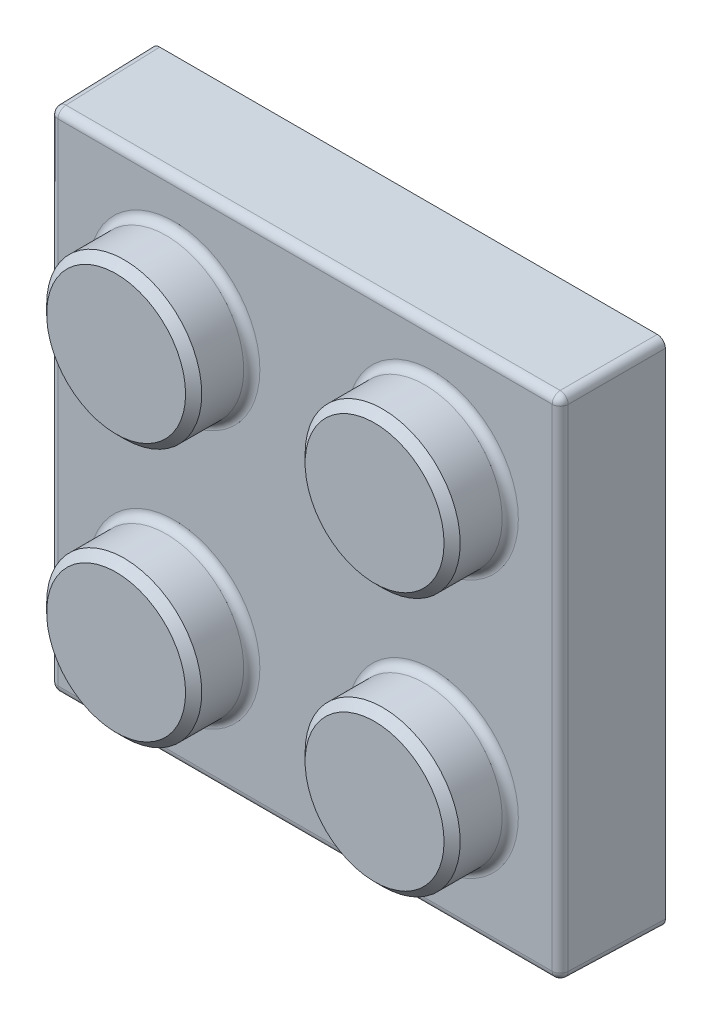
ISO-10303-21;
HEADER;
FILE_DESCRIPTION(('STEP AP214'),'2;1');
FILE_NAME('part.step','',(''),(''),'','','');
FILE_SCHEMA(('AUTOMOTIVE_DESIGN { 1 0 10303 214 1 1 1 1 }'));
ENDSEC;
DATA;
#1=APPLICATION_CONTEXT('core data for automotive mechanical design processes');
#2=APPLICATION_PROTOCOL_DEFINITION('international standard','automotive_design',2000,#1);
#3=PRODUCT_CONTEXT('',#1,'mechanical');
#4=PRODUCT('Part','Part','',(#3));
#5=PRODUCT_RELATED_PRODUCT_CATEGORY('part','',(#4));
#6=PRODUCT_DEFINITION_FORMATION('','',#4);
#7=PRODUCT_DEFINITION_CONTEXT('part definition',#1,'design');
#8=PRODUCT_DEFINITION('design','',#6,#7);
#9=PRODUCT_DEFINITION_SHAPE('','',#8);
#10=(LENGTH_UNIT() NAMED_UNIT(*) SI_UNIT(.MILLI.,.METRE.));
#11=(NAMED_UNIT(*) PLANE_ANGLE_UNIT() SI_UNIT($,.RADIAN.));
#12=(NAMED_UNIT(*) SI_UNIT($,.STERADIAN.) SOLID_ANGLE_UNIT());
#13=UNCERTAINTY_MEASURE_WITH_UNIT(LENGTH_MEASURE(1.E-05),#10,'distance_accuracy_value','');
#14=(GEOMETRIC_REPRESENTATION_CONTEXT(3) GLOBAL_UNCERTAINTY_ASSIGNED_CONTEXT((#13)) GLOBAL_UNIT_ASSIGNED_CONTEXT((#10,
#11,#12)) REPRESENTATION_CONTEXT('',''));
#15=CARTESIAN_POINT('',(0.,0.,0.));
#16=DIRECTION('',(0.,0.,1.));
#17=DIRECTION('',(1.,0.,0.));
#18=AXIS2_PLACEMENT_3D('',#15,#16,#17);
#19=CARTESIAN_POINT('',(0.,0.,0.));
#20=DIRECTION('',(0.,0.,-1.));
#21=DIRECTION('',(-1.,0.,0.));
#22=AXIS2_PLACEMENT_3D('',#19,#20,#21);
#23=PLANE('',#22);
#24=DIRECTION('',(0.,-1.,0.));
#25=VECTOR('',#24,1.);
#26=CARTESIAN_POINT('',(-7.95,7.89999999999999,0.));
#27=LINE('',#26,#25);
#28=CARTESIAN_POINT('',(-7.95,7.6500380762109,0.));
#29=VERTEX_POINT('',#28);
#30=CARTESIAN_POINT('',(-7.95,-7.65003807621091,0.));
#31=VERTEX_POINT('',#30);
#32=EDGE_CURVE('E232',#29,#31,#27,.T.);
#33=ORIENTED_EDGE('',*,*,#32,.F.);
#34=CARTESIAN_POINT('',(-7.69996191798902,7.64996191798902,0.));
#35=DIRECTION('',(0.,0.,-1.));
#36=DIRECTION('',(-0.707106781186548,0.707106781186547,0.));
#37=AXIS2_PLACEMENT_3D('',#34,#35,#36);
#38=ELLIPSE('',#37,0.250076158222762,0.25);
#39=CARTESIAN_POINT('',(-7.7000380762109,7.89999999999999,0.));
#40=VERTEX_POINT('',#39);
#41=EDGE_CURVE('E11',#29,#40,#38,.T.);
#42=ORIENTED_EDGE('',*,*,#41,.T.);
#43=DIRECTION('',(-1.,0.,0.));
#44=VECTOR('',#43,1.);
#45=CARTESIAN_POINT('',(7.95,7.9,0.));
#46=LINE('',#45,#44);
#47=CARTESIAN_POINT('',(7.7000380762109,7.9,0.));
#48=VERTEX_POINT('',#47);
#49=EDGE_CURVE('E243',#48,#40,#46,.T.);
#50=ORIENTED_EDGE('',*,*,#49,.F.);
#51=CARTESIAN_POINT('',(7.69996191798903,7.64996191798902,0.));
#52=DIRECTION('',(0.,0.,-1.));
#53=DIRECTION('',(0.707106781186547,0.707106781186548,0.));
#54=AXIS2_PLACEMENT_3D('',#51,#52,#53);
#55=ELLIPSE('',#54,0.250076158222762,0.25);
#56=CARTESIAN_POINT('',(7.95,7.6500380762109,0.));
#57=VERTEX_POINT('',#56);
#58=EDGE_CURVE('E54',#48,#57,#55,.T.);
#59=ORIENTED_EDGE('',*,*,#58,.T.);
#60=DIRECTION('',(0.,1.,0.));
#61=VECTOR('',#60,1.);
#62=CARTESIAN_POINT('',(7.95,7.9,0.));
#63=LINE('',#62,#61);
#64=CARTESIAN_POINT('',(7.95,-7.65003807621091,0.));
#65=VERTEX_POINT('',#64);
#66=EDGE_CURVE('E239',#65,#57,#63,.T.);
#67=ORIENTED_EDGE('',*,*,#66,.F.);
#68=CARTESIAN_POINT('',(7.69996191798903,-7.64996191798903,0.));
#69=DIRECTION('',(0.,0.,-1.));
#70=DIRECTION('',(0.707106781186548,-0.707106781186547,0.));
#71=AXIS2_PLACEMENT_3D('',#68,#69,#70);
#72=ELLIPSE('',#71,0.250076158222762,0.25);
#73=CARTESIAN_POINT('',(7.70003807621091,-7.90000000000001,0.));
#74=VERTEX_POINT('',#73);
#75=EDGE_CURVE('E354',#65,#74,#72,.T.);
#76=ORIENTED_EDGE('',*,*,#75,.T.);
#77=DIRECTION('',(1.,0.,0.));
#78=VECTOR('',#77,1.);
#79=CARTESIAN_POINT('',(7.95,-7.90000000000001,0.));
#80=LINE('',#79,#78);
#81=CARTESIAN_POINT('',(-7.7000380762109,-7.90000000000001,0.));
#82=VERTEX_POINT('',#81);
#83=EDGE_CURVE('E235',#82,#74,#80,.T.);
#84=ORIENTED_EDGE('',*,*,#83,.F.);
#85=CARTESIAN_POINT('',(-7.69996191798902,-7.64996191798903,0.));
#86=DIRECTION('',(0.,0.,-1.));
#87=DIRECTION('',(-0.707106781186547,-0.707106781186548,0.));
#88=AXIS2_PLACEMENT_3D('',#85,#86,#87);
#89=ELLIPSE('',#88,0.250076158222762,0.25);
#90=EDGE_CURVE('E351',#82,#31,#89,.T.);
#91=ORIENTED_EDGE('',*,*,#90,.T.);
#92=EDGE_LOOP('',(#33,#42,#50,#59,#67,#76,#84,#91));
#93=FACE_BOUND('',#92,.T.);
#94=DIRECTION('',(1.,0.,0.));
#95=VECTOR('',#94,1.);
#96=CARTESIAN_POINT('',(0.,6.6998172063473,0.));
#97=LINE('',#96,#95);
#98=CARTESIAN_POINT('',(6.74981720634731,6.69981720634731,0.));
#99=VERTEX_POINT('',#98);
#100=CARTESIAN_POINT('',(-6.74981720634731,6.6998172063473,0.));
#101=VERTEX_POINT('',#100);
#102=EDGE_CURVE('E200',#99,#101,#97,.F.);
#103=ORIENTED_EDGE('',*,*,#102,.T.);
#104=DIRECTION('',(0.,1.,0.));
#105=VECTOR('',#104,1.);
#106=CARTESIAN_POINT('',(-6.74981720634731,0.,0.));
#107=LINE('',#106,#105);
#108=CARTESIAN_POINT('',(-6.74981720634731,-6.69981720634732,0.));
#109=VERTEX_POINT('',#108);
#110=EDGE_CURVE('E195',#101,#109,#107,.F.);
#111=ORIENTED_EDGE('',*,*,#110,.T.);
#112=DIRECTION('',(-1.,0.,0.));
#113=VECTOR('',#112,1.);
#114=CARTESIAN_POINT('',(0.,-6.69981720634732,0.));
#115=LINE('',#114,#113);
#116=CARTESIAN_POINT('',(6.74981720634731,-6.69981720634732,0.));
#117=VERTEX_POINT('',#116);
#118=EDGE_CURVE('E199',#109,#117,#115,.F.);
#119=ORIENTED_EDGE('',*,*,#118,.T.);
#120=DIRECTION('',(0.,-1.,0.));
#121=VECTOR('',#120,1.);
#122=CARTESIAN_POINT('',(6.74981720634731,0.,0.));
#123=LINE('',#122,#121);
#124=EDGE_CURVE('E166',#117,#99,#123,.F.);
#125=ORIENTED_EDGE('',*,*,#124,.T.);
#126=EDGE_LOOP('',(#103,#111,#119,#125));
#127=FACE_BOUND('',#126,.T.);
#128=ADVANCED_FACE('F44',(#93,#127),#23,.T.);
#129=CARTESIAN_POINT('',(3.95,3.99999999999999,5.));
#130=DIRECTION('',(0.,0.,-1.));
#131=DIRECTION('',(-1.,0.,0.));
#132=AXIS2_PLACEMENT_3D('',#129,#130,#131);
#133=CONICAL_SURFACE('',#132,2.15,0.785398163397446);
#134=CARTESIAN_POINT('',(3.95,3.99999999999999,4.75));
#135=DIRECTION('',(0.,0.,1.));
#136=DIRECTION('',(1.,0.,0.));
#137=AXIS2_PLACEMENT_3D('',#134,#135,#136);
#138=CIRCLE('',#137,2.4);
#139=CARTESIAN_POINT('',(6.35,3.99999999999999,4.75));
#140=VERTEX_POINT('',#139);
#141=EDGE_CURVE('E263',#140,#140,#138,.F.);
#142=ORIENTED_EDGE('',*,*,#141,.F.);
#143=EDGE_LOOP('',(#142));
#144=FACE_BOUND('',#143,.T.);
#145=CARTESIAN_POINT('',(3.95,3.99999999999999,5.));
#146=DIRECTION('',(0.,0.,1.));
#147=DIRECTION('',(1.,0.,0.));
#148=AXIS2_PLACEMENT_3D('',#145,#146,#147);
#149=CIRCLE('',#148,2.15);
#150=CARTESIAN_POINT('',(6.1,3.99999999999999,5.));
#151=VERTEX_POINT('',#150);
#152=EDGE_CURVE('E267',#151,#151,#149,.T.);
#153=ORIENTED_EDGE('',*,*,#152,.F.);
#154=EDGE_LOOP('',(#153));
#155=FACE_BOUND('',#154,.T.);
#156=ADVANCED_FACE('F479',(#144,#155),#133,.T.);
#157=CARTESIAN_POINT('',(3.95,3.99999999999999,5.));
#158=DIRECTION('',(0.,0.,1.));
#159=DIRECTION('',(1.,0.,0.));
#160=AXIS2_PLACEMENT_3D('',#157,#158,#159);
#161=PLANE('',#160);
#162=ORIENTED_EDGE('',*,*,#152,.T.);
#163=EDGE_LOOP('',(#162));
#164=FACE_BOUND('',#163,.T.);
#165=ADVANCED_FACE('F484',(#164),#161,.T.);
#166=CARTESIAN_POINT('',(3.95,3.99999999999999,5.));
#167=DIRECTION('',(0.,0.,-1.));
#168=DIRECTION('',(-1.,0.,0.));
#169=AXIS2_PLACEMENT_3D('',#166,#167,#168);
#170=CYLINDRICAL_SURFACE('',#169,2.4);
#171=CARTESIAN_POINT('',(3.95,3.99999999999999,3.45));
#172=DIRECTION('',(0.,0.,-1.));
#173=DIRECTION('',(-1.,0.,0.));
#174=AXIS2_PLACEMENT_3D('',#171,#172,#173);
#175=CIRCLE('',#174,2.4);
#176=CARTESIAN_POINT('',(1.55,3.99999999999999,3.45));
#177=VERTEX_POINT('',#176);
#178=EDGE_CURVE('E271',#177,#177,#175,.F.);
#179=ORIENTED_EDGE('',*,*,#178,.T.);
#180=EDGE_LOOP('',(#179));
#181=FACE_BOUND('',#180,.T.);
#182=ORIENTED_EDGE('',*,*,#141,.T.);
#183=EDGE_LOOP('',(#182));
#184=FACE_BOUND('',#183,.T.);
#185=ADVANCED_FACE('F523',(#181,#184),#170,.T.);
#186=CARTESIAN_POINT('',(3.95,-4.00000000000001,5.));
#187=DIRECTION('',(0.,0.,-1.));
#188=DIRECTION('',(-1.,0.,0.));
#189=AXIS2_PLACEMENT_3D('',#186,#187,#188);
#190=CONICAL_SURFACE('',#189,2.15,0.785398163397446);
#191=CARTESIAN_POINT('',(3.95,-4.00000000000001,4.75));
#192=DIRECTION('',(0.,0.,1.));
#193=DIRECTION('',(1.,0.,0.));
#194=AXIS2_PLACEMENT_3D('',#191,#192,#193);
#195=CIRCLE('',#194,2.4);
#196=CARTESIAN_POINT('',(6.35,-4.00000000000001,4.75));
#197=VERTEX_POINT('',#196);
#198=EDGE_CURVE('E255',#197,#197,#195,.F.);
#199=ORIENTED_EDGE('',*,*,#198,.F.);
#200=EDGE_LOOP('',(#199));
#201=FACE_BOUND('',#200,.T.);
#202=CARTESIAN_POINT('',(3.95,-4.00000000000001,5.));
#203=DIRECTION('',(0.,0.,1.));
#204=DIRECTION('',(1.,0.,0.));
#205=AXIS2_PLACEMENT_3D('',#202,#203,#204);
#206=CIRCLE('',#205,2.15);
#207=CARTESIAN_POINT('',(6.1,-4.00000000000001,5.));
#208=VERTEX_POINT('',#207);
#209=EDGE_CURVE('E259',#208,#208,#206,.T.);
#210=ORIENTED_EDGE('',*,*,#209,.F.);
#211=EDGE_LOOP('',(#210));
#212=FACE_BOUND('',#211,.T.);
#213=ADVANCED_FACE('F515',(#201,#212),#190,.T.);
#214=CARTESIAN_POINT('',(3.95,-4.00000000000001,5.));
#215=DIRECTION('',(0.,0.,1.));
#216=DIRECTION('',(1.,0.,0.));
#217=AXIS2_PLACEMENT_3D('',#214,#215,#216);
#218=PLANE('',#217);
#219=ORIENTED_EDGE('',*,*,#209,.T.);
#220=EDGE_LOOP('',(#219));
#221=FACE_BOUND('',#220,.T.);
#222=ADVANCED_FACE('F511',(#221),#218,.T.);
#223=CARTESIAN_POINT('',(3.95,-4.00000000000001,5.));
#224=DIRECTION('',(0.,0.,-1.));
#225=DIRECTION('',(-1.,0.,0.));
#226=AXIS2_PLACEMENT_3D('',#223,#224,#225);
#227=CYLINDRICAL_SURFACE('',#226,2.4);
#228=CARTESIAN_POINT('',(3.95,-4.00000000000001,3.45));
#229=DIRECTION('',(0.,0.,-1.));
#230=DIRECTION('',(-1.,0.,0.));
#231=AXIS2_PLACEMENT_3D('',#228,#229,#230);
#232=CIRCLE('',#231,2.4);
#233=CARTESIAN_POINT('',(1.55,-4.00000000000001,3.45));
#234=VERTEX_POINT('',#233);
#235=EDGE_CURVE('E304',#234,#234,#232,.F.);
#236=ORIENTED_EDGE('',*,*,#235,.T.);
#237=EDGE_LOOP('',(#236));
#238=FACE_BOUND('',#237,.T.);
#239=ORIENTED_EDGE('',*,*,#198,.T.);
#240=EDGE_LOOP('',(#239));
#241=FACE_BOUND('',#240,.T.);
#242=ADVANCED_FACE('F492',(#238,#241),#227,.T.);
#243=CARTESIAN_POINT('',(-7.95,7.89999999999999,0.));
#244=DIRECTION('',(-0.999847695156391,0.,0.0174524064372835));
#245=DIRECTION('',(0.0174524064372835,0.,0.999847695156391));
#246=AXIS2_PLACEMENT_3D('',#243,#244,#245);
#247=PLANE('',#246);
#248=DIRECTION('',(0.,-1.,0.));
#249=VECTOR('',#248,1.);
#250=CARTESIAN_POINT('',(-7.89843140023988,7.89999999999999,2.95436310160932));
#251=LINE('',#250,#249);
#252=CARTESIAN_POINT('',(-7.89843140023988,-7.59846947645079,2.95436310160932));
#253=VERTEX_POINT('',#252);
#254=CARTESIAN_POINT('',(-7.89843140023988,7.59846947645077,2.95436310160932));
#255=VERTEX_POINT('',#254);
#256=EDGE_CURVE('E62',#253,#255,#251,.F.);
#257=ORIENTED_EDGE('',*,*,#256,.T.);
#258=DIRECTION('',(0.0174497491606827,-0.0174497491606827,0.999695459881888));
#259=VECTOR('',#258,1.);
#260=CARTESIAN_POINT('',(-7.95007611184247,7.65011418805337,-0.00436044453501649));
#261=LINE('',#260,#259);
#262=EDGE_CURVE('E340',#255,#29,#261,.F.);
#263=ORIENTED_EDGE('',*,*,#262,.T.);
#264=ORIENTED_EDGE('',*,*,#32,.T.);
#265=DIRECTION('',(0.0174497491606827,0.0174497491606827,0.999695459881888));
#266=VECTOR('',#265,1.);
#267=CARTESIAN_POINT('',(-7.9452651106593,-7.64530318687021,0.271261628654778));
#268=LINE('',#267,#266);
#269=EDGE_CURVE('E67',#31,#253,#268,.T.);
#270=ORIENTED_EDGE('',*,*,#269,.T.);
#271=EDGE_LOOP('',(#257,#263,#264,#270));
#272=FACE_BOUND('',#271,.T.);
#273=ADVANCED_FACE('F440',(#272),#247,.T.);
#274=CARTESIAN_POINT('',(7.95,-7.90000000000001,0.));
#275=DIRECTION('',(0.,-0.999847695156391,0.0174524064372835));
#276=DIRECTION('',(0.,-0.0174524064372835,-0.999847695156391));
#277=AXIS2_PLACEMENT_3D('',#274,#275,#276);
#278=PLANE('',#277);
#279=ORIENTED_EDGE('',*,*,#83,.T.);
#280=DIRECTION('',(-0.0174497491606827,0.0174497491606827,0.999695459881888));
#281=VECTOR('',#280,1.);
#282=CARTESIAN_POINT('',(7.70011418805338,-7.90007611184248,-0.00436044453501648));
#283=LINE('',#282,#281);
#284=CARTESIAN_POINT('',(7.64846947645078,-7.84843140023988,2.95436310160932));
#285=VERTEX_POINT('',#284);
#286=EDGE_CURVE('E333',#74,#285,#283,.T.);
#287=ORIENTED_EDGE('',*,*,#286,.T.);
#288=DIRECTION('',(1.,0.,0.));
#289=VECTOR('',#288,1.);
#290=CARTESIAN_POINT('',(7.95,-7.84843140023988,2.95436310160932));
#291=LINE('',#290,#289);
#292=CARTESIAN_POINT('',(-7.64846947645078,-7.84843140023989,2.95436310160932));
#293=VERTEX_POINT('',#292);
#294=EDGE_CURVE('E330',#285,#293,#291,.F.);
#295=ORIENTED_EDGE('',*,*,#294,.T.);
#296=DIRECTION('',(0.0174497491606827,0.0174497491606827,0.999695459881888));
#297=VECTOR('',#296,1.);
#298=CARTESIAN_POINT('',(-7.69527273749562,-7.89523466128473,0.273006072155979));
#299=LINE('',#298,#297);
#300=EDGE_CURVE('E327',#293,#82,#299,.F.);
#301=ORIENTED_EDGE('',*,*,#300,.T.);
#302=EDGE_LOOP('',(#279,#287,#295,#301));
#303=FACE_BOUND('',#302,.T.);
#304=ADVANCED_FACE('F430',(#303),#278,.T.);
#305=CARTESIAN_POINT('',(7.95,7.9,0.));
#306=DIRECTION('',(0.999847695156391,0.,0.0174524064372835));
#307=DIRECTION('',(0.0174524064372835,0.,-0.999847695156391));
#308=AXIS2_PLACEMENT_3D('',#305,#306,#307);
#309=PLANE('',#308);
#310=ORIENTED_EDGE('',*,*,#66,.T.);
#311=DIRECTION('',(-0.0174497491606827,-0.0174497491606827,0.999695459881888));
#312=VECTOR('',#311,1.);
#313=CARTESIAN_POINT('',(7.95007611184248,7.65011418805337,-0.0043604445350165));
#314=LINE('',#313,#312);
#315=CARTESIAN_POINT('',(7.89843140023988,7.59846947645078,2.95436310160932));
#316=VERTEX_POINT('',#315);
#317=EDGE_CURVE('E324',#57,#316,#314,.T.);
#318=ORIENTED_EDGE('',*,*,#317,.T.);
#319=DIRECTION('',(0.,1.,0.));
#320=VECTOR('',#319,1.);
#321=CARTESIAN_POINT('',(7.89843140023988,7.9,2.95436310160932));
#322=LINE('',#321,#320);
#323=CARTESIAN_POINT('',(7.89843140023988,-7.59846947645079,2.95436310160932));
#324=VERTEX_POINT('',#323);
#325=EDGE_CURVE('E321',#316,#324,#322,.F.);
#326=ORIENTED_EDGE('',*,*,#325,.T.);
#327=DIRECTION('',(-0.0174497491606827,0.0174497491606827,0.999695459881888));
#328=VECTOR('',#327,1.);
#329=CARTESIAN_POINT('',(7.9452651106593,-7.6453031868702,0.271261628654778));
#330=LINE('',#329,#328);
#331=EDGE_CURVE('E318',#324,#65,#330,.F.);
#332=ORIENTED_EDGE('',*,*,#331,.T.);
#333=EDGE_LOOP('',(#310,#318,#326,#332));
#334=FACE_BOUND('',#333,.T.);
#335=ADVANCED_FACE('F464',(#334),#309,.T.);
#336=CARTESIAN_POINT('',(7.95,7.9,0.));
#337=DIRECTION('',(0.,0.999847695156391,0.0174524064372835));
#338=DIRECTION('',(0.,-0.0174524064372835,0.999847695156391));
#339=AXIS2_PLACEMENT_3D('',#336,#337,#338);
#340=PLANE('',#339);
#341=ORIENTED_EDGE('',*,*,#49,.T.);
#342=DIRECTION('',(0.0174497491606827,-0.0174497491606827,0.999695459881888));
#343=VECTOR('',#342,1.);
#344=CARTESIAN_POINT('',(-7.69527273749562,7.89523466128471,0.273006072155979));
#345=LINE('',#344,#343);
#346=CARTESIAN_POINT('',(-7.64846947645078,7.84843140023987,2.95436310160932));
#347=VERTEX_POINT('',#346);
#348=EDGE_CURVE('E315',#40,#347,#345,.T.);
#349=ORIENTED_EDGE('',*,*,#348,.T.);
#350=DIRECTION('',(-1.,0.,0.));
#351=VECTOR('',#350,1.);
#352=CARTESIAN_POINT('',(7.95,7.84843140023987,2.95436310160932));
#353=LINE('',#352,#351);
#354=CARTESIAN_POINT('',(7.64846947645078,7.84843140023987,2.95436310160932));
#355=VERTEX_POINT('',#354);
#356=EDGE_CURVE('E311',#347,#355,#353,.F.);
#357=ORIENTED_EDGE('',*,*,#356,.T.);
#358=DIRECTION('',(-0.0174497491606827,-0.0174497491606827,0.999695459881888));
#359=VECTOR('',#358,1.);
#360=CARTESIAN_POINT('',(7.70011418805338,7.90007611184247,-0.0043604445350165));
#361=LINE('',#360,#359);
#362=EDGE_CURVE('E308',#355,#48,#361,.F.);
#363=ORIENTED_EDGE('',*,*,#362,.T.);
#364=EDGE_LOOP('',(#341,#349,#357,#363));
#365=FACE_BOUND('',#364,.T.);
#366=ADVANCED_FACE('F455',(#365),#340,.T.);
#367=CARTESIAN_POINT('',(0.,0.,3.2));
#368=DIRECTION('',(0.,0.,-1.));
#369=DIRECTION('',(-1.,0.,0.));
#370=AXIS2_PLACEMENT_3D('',#367,#368,#369);
#371=PLANE('',#370);
#372=CARTESIAN_POINT('',(3.95,3.99999999999999,3.2));
#373=DIRECTION('',(0.,0.,-1.));
#374=DIRECTION('',(-1.,0.,0.));
#375=AXIS2_PLACEMENT_3D('',#372,#373,#374);
#376=CIRCLE('',#375,2.65);
#377=CARTESIAN_POINT('',(1.3,3.99999999999999,3.2));
#378=VERTEX_POINT('',#377);
#379=EDGE_CURVE('E300',#378,#378,#376,.T.);
#380=ORIENTED_EDGE('',*,*,#379,.T.);
#381=EDGE_LOOP('',(#380));
#382=FACE_BOUND('',#381,.T.);
#383=CARTESIAN_POINT('',(3.95,-4.00000000000001,3.2));
#384=DIRECTION('',(0.,0.,-1.));
#385=DIRECTION('',(-1.,0.,0.));
#386=AXIS2_PLACEMENT_3D('',#383,#384,#385);
#387=CIRCLE('',#386,2.65);
#388=CARTESIAN_POINT('',(1.3,-4.00000000000001,3.2));
#389=VERTEX_POINT('',#388);
#390=EDGE_CURVE('E296',#389,#389,#387,.T.);
#391=ORIENTED_EDGE('',*,*,#390,.T.);
#392=EDGE_LOOP('',(#391));
#393=FACE_BOUND('',#392,.T.);
#394=DIRECTION('',(0.,-1.,0.));
#395=VECTOR('',#394,1.);
#396=CARTESIAN_POINT('',(7.64846947645078,0.,3.2));
#397=LINE('',#396,#395);
#398=CARTESIAN_POINT('',(7.64846947645078,-7.59846947645079,3.2));
#399=VERTEX_POINT('',#398);
#400=CARTESIAN_POINT('',(7.64846947645078,7.59846947645078,3.2));
#401=VERTEX_POINT('',#400);
#402=EDGE_CURVE('E289',#399,#401,#397,.F.);
#403=ORIENTED_EDGE('',*,*,#402,.T.);
#404=DIRECTION('',(1.,0.,0.));
#405=VECTOR('',#404,1.);
#406=CARTESIAN_POINT('',(0.,7.59846947645078,3.2));
#407=LINE('',#406,#405);
#408=CARTESIAN_POINT('',(-7.64846947645078,7.59846947645077,3.2));
#409=VERTEX_POINT('',#408);
#410=EDGE_CURVE('E292',#401,#409,#407,.F.);
#411=ORIENTED_EDGE('',*,*,#410,.T.);
#412=DIRECTION('',(0.,1.,0.));
#413=VECTOR('',#412,1.);
#414=CARTESIAN_POINT('',(-7.64846947645078,0.,3.2));
#415=LINE('',#414,#413);
#416=CARTESIAN_POINT('',(-7.64846947645078,-7.59846947645079,3.2));
#417=VERTEX_POINT('',#416);
#418=EDGE_CURVE('E283',#409,#417,#415,.F.);
#419=ORIENTED_EDGE('',*,*,#418,.T.);
#420=DIRECTION('',(-1.,0.,0.));
#421=VECTOR('',#420,1.);
#422=CARTESIAN_POINT('',(0.,-7.59846947645079,3.2));
#423=LINE('',#422,#421);
#424=EDGE_CURVE('E286',#417,#399,#423,.F.);
#425=ORIENTED_EDGE('',*,*,#424,.T.);
#426=EDGE_LOOP('',(#403,#411,#419,#425));
#427=FACE_BOUND('',#426,.T.);
#428=CARTESIAN_POINT('',(-4.05,-4.00000000000001,3.2));
#429=DIRECTION('',(0.,0.,-1.));
#430=DIRECTION('',(-1.,0.,0.));
#431=AXIS2_PLACEMENT_3D('',#428,#429,#430);
#432=CIRCLE('',#431,2.65);
#433=CARTESIAN_POINT('',(-6.7,-4.00000000000001,3.2));
#434=VERTEX_POINT('',#433);
#435=EDGE_CURVE('E279',#434,#434,#432,.T.);
#436=ORIENTED_EDGE('',*,*,#435,.T.);
#437=EDGE_LOOP('',(#436));
#438=FACE_BOUND('',#437,.T.);
#439=CARTESIAN_POINT('',(-4.05,3.99999999999999,3.2));
#440=DIRECTION('',(0.,0.,-1.));
#441=DIRECTION('',(-1.,0.,0.));
#442=AXIS2_PLACEMENT_3D('',#439,#440,#441);
#443=CIRCLE('',#442,2.65);
#444=CARTESIAN_POINT('',(-6.7,3.99999999999999,3.2));
#445=VERTEX_POINT('',#444);
#446=EDGE_CURVE('E275',#445,#445,#443,.T.);
#447=ORIENTED_EDGE('',*,*,#446,.T.);
#448=EDGE_LOOP('',(#447));
#449=FACE_BOUND('',#448,.T.);
#450=ADVANCED_FACE('F419',(#382,#393,#427,#438,#449),#371,.F.);
#451=CARTESIAN_POINT('',(-4.05,-4.00000000000001,5.));
#452=DIRECTION('',(0.,0.,-1.));
#453=DIRECTION('',(-1.,0.,0.));
#454=AXIS2_PLACEMENT_3D('',#451,#452,#453);
#455=CYLINDRICAL_SURFACE('',#454,2.4);
#456=CARTESIAN_POINT('',(-4.05,-4.00000000000001,3.45));
#457=DIRECTION('',(0.,0.,-1.));
#458=DIRECTION('',(-1.,0.,0.));
#459=AXIS2_PLACEMENT_3D('',#456,#457,#458);
#460=CIRCLE('',#459,2.4);
#461=CARTESIAN_POINT('',(-6.45,-4.00000000000001,3.45));
#462=VERTEX_POINT('',#461);
#463=EDGE_CURVE('E343',#462,#462,#460,.F.);
#464=ORIENTED_EDGE('',*,*,#463,.T.);
#465=EDGE_LOOP('',(#464));
#466=FACE_BOUND('',#465,.T.);
#467=CARTESIAN_POINT('',(-4.05,-4.00000000000001,4.75));
#468=DIRECTION('',(0.,0.,1.));
#469=DIRECTION('',(1.,0.,0.));
#470=AXIS2_PLACEMENT_3D('',#467,#468,#469);
#471=CIRCLE('',#470,2.4);
#472=CARTESIAN_POINT('',(-1.65,-4.00000000000001,4.75));
#473=VERTEX_POINT('',#472);
#474=EDGE_CURVE('E251',#473,#473,#471,.F.);
#475=ORIENTED_EDGE('',*,*,#474,.T.);
#476=EDGE_LOOP('',(#475));
#477=FACE_BOUND('',#476,.T.);
#478=ADVANCED_FACE('F921',(#466,#477),#455,.T.);
#479=CARTESIAN_POINT('',(-4.05,-4.00000000000001,5.));
#480=DIRECTION('',(0.,0.,1.));
#481=DIRECTION('',(1.,0.,0.));
#482=AXIS2_PLACEMENT_3D('',#479,#480,#481);
#483=PLANE('',#482);
#484=CARTESIAN_POINT('',(-4.05,-4.00000000000001,5.));
#485=DIRECTION('',(0.,0.,1.));
#486=DIRECTION('',(1.,0.,0.));
#487=AXIS2_PLACEMENT_3D('',#484,#485,#486);
#488=CIRCLE('',#487,2.15);
#489=CARTESIAN_POINT('',(-1.9,-4.00000000000001,5.));
#490=VERTEX_POINT('',#489);
#491=EDGE_CURVE('E247',#490,#490,#488,.T.);
#492=ORIENTED_EDGE('',*,*,#491,.T.);
#493=EDGE_LOOP('',(#492));
#494=FACE_BOUND('',#493,.T.);
#495=ADVANCED_FACE('F507',(#494),#483,.T.);
#496=CARTESIAN_POINT('',(-4.05,-4.00000000000001,5.));
#497=DIRECTION('',(0.,0.,-1.));
#498=DIRECTION('',(-1.,0.,0.));
#499=AXIS2_PLACEMENT_3D('',#496,#497,#498);
#500=CONICAL_SURFACE('',#499,2.15,0.785398163397446);
#501=ORIENTED_EDGE('',*,*,#474,.F.);
#502=EDGE_LOOP('',(#501));
#503=FACE_BOUND('',#502,.T.);
#504=ORIENTED_EDGE('',*,*,#491,.F.);
#505=EDGE_LOOP('',(#504));
#506=FACE_BOUND('',#505,.T.);
#507=ADVANCED_FACE('F500',(#503,#506),#500,.T.);
#508=CARTESIAN_POINT('',(-4.05,3.99999999999999,5.));
#509=DIRECTION('',(0.,0.,-1.));
#510=DIRECTION('',(-1.,0.,0.));
#511=AXIS2_PLACEMENT_3D('',#508,#509,#510);
#512=CYLINDRICAL_SURFACE('',#511,2.4);
#513=CARTESIAN_POINT('',(-4.05,3.99999999999999,3.45));
#514=DIRECTION('',(0.,0.,-1.));
#515=DIRECTION('',(-1.,0.,0.));
#516=AXIS2_PLACEMENT_3D('',#513,#514,#515);
#517=CIRCLE('',#516,2.4);
#518=CARTESIAN_POINT('',(-6.45,3.99999999999999,3.45));
#519=VERTEX_POINT('',#518);
#520=EDGE_CURVE('E347',#519,#519,#517,.F.);
#521=ORIENTED_EDGE('',*,*,#520,.T.);
#522=EDGE_LOOP('',(#521));
#523=FACE_BOUND('',#522,.T.);
#524=CARTESIAN_POINT('',(-4.05,3.99999999999999,4.75));
#525=DIRECTION('',(0.,0.,1.));
#526=DIRECTION('',(1.,0.,0.));
#527=AXIS2_PLACEMENT_3D('',#524,#525,#526);
#528=CIRCLE('',#527,2.4);
#529=CARTESIAN_POINT('',(-1.65,3.99999999999999,4.75));
#530=VERTEX_POINT('',#529);
#531=EDGE_CURVE('E224',#530,#530,#528,.F.);
#532=ORIENTED_EDGE('',*,*,#531,.T.);
#533=EDGE_LOOP('',(#532));
#534=FACE_BOUND('',#533,.T.);
#535=ADVANCED_FACE('F506',(#523,#534),#512,.T.);
#536=CARTESIAN_POINT('',(-4.05,3.99999999999999,5.));
#537=DIRECTION('',(0.,0.,1.));
#538=DIRECTION('',(1.,0.,0.));
#539=AXIS2_PLACEMENT_3D('',#536,#537,#538);
#540=PLANE('',#539);
#541=CARTESIAN_POINT('',(-4.05,3.99999999999999,5.));
#542=DIRECTION('',(0.,0.,1.));
#543=DIRECTION('',(1.,0.,0.));
#544=AXIS2_PLACEMENT_3D('',#541,#542,#543);
#545=CIRCLE('',#544,2.15);
#546=CARTESIAN_POINT('',(-1.9,3.99999999999999,5.));
#547=VERTEX_POINT('',#546);
#548=EDGE_CURVE('E228',#547,#547,#545,.T.);
#549=ORIENTED_EDGE('',*,*,#548,.T.);
#550=EDGE_LOOP('',(#549));
#551=FACE_BOUND('',#550,.T.);
#552=ADVANCED_FACE('F841',(#551),#540,.T.);
#553=CARTESIAN_POINT('',(-4.05,3.99999999999999,5.));
#554=DIRECTION('',(0.,0.,-1.));
#555=DIRECTION('',(-1.,0.,0.));
#556=AXIS2_PLACEMENT_3D('',#553,#554,#555);
#557=CONICAL_SURFACE('',#556,2.15,0.785398163397446);
#558=ORIENTED_EDGE('',*,*,#531,.F.);
#559=EDGE_LOOP('',(#558));
#560=FACE_BOUND('',#559,.T.);
#561=ORIENTED_EDGE('',*,*,#548,.F.);
#562=EDGE_LOOP('',(#561));
#563=FACE_BOUND('',#562,.T.);
#564=ADVANCED_FACE('F700',(#560,#563),#557,.T.);
#565=CARTESIAN_POINT('',(-4.05,3.99999999999999,3.8));
#566=DIRECTION('',(0.,0.,1.));
#567=DIRECTION('',(1.,0.,0.));
#568=AXIS2_PLACEMENT_3D('',#565,#566,#567);
#569=PLANE('',#568);
#570=CARTESIAN_POINT('',(-4.05,3.99999999999999,3.8));
#571=DIRECTION('',(0.,0.,1.));
#572=DIRECTION('',(1.,0.,0.));
#573=AXIS2_PLACEMENT_3D('',#570,#571,#572);
#574=CIRCLE('',#573,1.2);
#575=CARTESIAN_POINT('',(-2.85,3.99999999999999,3.8));
#576=VERTEX_POINT('',#575);
#577=EDGE_CURVE('E220',#576,#576,#574,.T.);
#578=ORIENTED_EDGE('',*,*,#577,.F.);
#579=EDGE_LOOP('',(#578));
#580=FACE_BOUND('',#579,.T.);
#581=ADVANCED_FACE('F692',(#580),#569,.F.);
#582=CARTESIAN_POINT('',(-4.05,-4.00000000000001,3.8));
#583=DIRECTION('',(0.,0.,1.));
#584=DIRECTION('',(1.,0.,0.));
#585=AXIS2_PLACEMENT_3D('',#582,#583,#584);
#586=PLANE('',#585);
#587=CARTESIAN_POINT('',(-4.05,-4.00000000000001,3.8));
#588=DIRECTION('',(0.,0.,1.));
#589=DIRECTION('',(1.,0.,0.));
#590=AXIS2_PLACEMENT_3D('',#587,#588,#589);
#591=CIRCLE('',#590,1.2);
#592=CARTESIAN_POINT('',(-2.85,-4.00000000000001,3.8));
#593=VERTEX_POINT('',#592);
#594=EDGE_CURVE('E216',#593,#593,#591,.T.);
#595=ORIENTED_EDGE('',*,*,#594,.F.);
#596=EDGE_LOOP('',(#595));
#597=FACE_BOUND('',#596,.T.);
#598=ADVANCED_FACE('F699',(#597),#586,.F.);
#599=CARTESIAN_POINT('',(3.95,-4.00000000000001,3.8));
#600=DIRECTION('',(0.,0.,1.));
#601=DIRECTION('',(1.,0.,0.));
#602=AXIS2_PLACEMENT_3D('',#599,#600,#601);
#603=PLANE('',#602);
#604=CARTESIAN_POINT('',(3.95,-4.00000000000001,3.8));
#605=DIRECTION('',(0.,0.,1.));
#606=DIRECTION('',(1.,0.,0.));
#607=AXIS2_PLACEMENT_3D('',#604,#605,#606);
#608=CIRCLE('',#607,1.2);
#609=CARTESIAN_POINT('',(5.15,-4.00000000000001,3.8));
#610=VERTEX_POINT('',#609);
#611=EDGE_CURVE('E212',#610,#610,#608,.T.);
#612=ORIENTED_EDGE('',*,*,#611,.F.);
#613=EDGE_LOOP('',(#612));
#614=FACE_BOUND('',#613,.T.);
#615=ADVANCED_FACE('F725',(#614),#603,.F.);
#616=CARTESIAN_POINT('',(3.95,3.99999999999999,3.8));
#617=DIRECTION('',(0.,0.,1.));
#618=DIRECTION('',(1.,0.,0.));
#619=AXIS2_PLACEMENT_3D('',#616,#617,#618);
#620=PLANE('',#619);
#621=CARTESIAN_POINT('',(3.95,3.99999999999999,3.8));
#622=DIRECTION('',(0.,0.,1.));
#623=DIRECTION('',(1.,0.,0.));
#624=AXIS2_PLACEMENT_3D('',#621,#622,#623);
#625=CIRCLE('',#624,1.2);
#626=CARTESIAN_POINT('',(5.15,3.99999999999999,3.8));
#627=VERTEX_POINT('',#626);
#628=EDGE_CURVE('E208',#627,#627,#625,.T.);
#629=ORIENTED_EDGE('',*,*,#628,.F.);
#630=EDGE_LOOP('',(#629));
#631=FACE_BOUND('',#630,.T.);
#632=ADVANCED_FACE('F808',(#631),#620,.F.);
#633=CARTESIAN_POINT('',(3.95,3.99999999999999,5.));
#634=DIRECTION('',(0.,0.,-1.));
#635=DIRECTION('',(-1.,0.,0.));
#636=AXIS2_PLACEMENT_3D('',#633,#634,#635);
#637=CYLINDRICAL_SURFACE('',#636,1.2);
#638=ORIENTED_EDGE('',*,*,#628,.T.);
#639=EDGE_LOOP('',(#638));
#640=FACE_BOUND('',#639,.T.);
#641=CARTESIAN_POINT('',(3.95,3.99999999999999,2.));
#642=DIRECTION('',(0.,0.,-1.));
#643=DIRECTION('',(-1.,0.,0.));
#644=AXIS2_PLACEMENT_3D('',#641,#642,#643);
#645=CIRCLE('',#644,1.2);
#646=CARTESIAN_POINT('',(2.75,3.99999999999999,2.));
#647=VERTEX_POINT('',#646);
#648=EDGE_CURVE('E186',#647,#647,#645,.F.);
#649=ORIENTED_EDGE('',*,*,#648,.F.);
#650=EDGE_LOOP('',(#649));
#651=FACE_BOUND('',#650,.T.);
#652=ADVANCED_FACE('F797',(#640,#651),#637,.F.);
#653=CARTESIAN_POINT('',(3.95,-4.00000000000001,5.));
#654=DIRECTION('',(0.,0.,-1.));
#655=DIRECTION('',(-1.,0.,0.));
#656=AXIS2_PLACEMENT_3D('',#653,#654,#655);
#657=CYLINDRICAL_SURFACE('',#656,1.2);
#658=ORIENTED_EDGE('',*,*,#611,.T.);
#659=EDGE_LOOP('',(#658));
#660=FACE_BOUND('',#659,.T.);
#661=CARTESIAN_POINT('',(3.95,-4.00000000000001,2.));
#662=DIRECTION('',(0.,0.,-1.));
#663=DIRECTION('',(-1.,0.,0.));
#664=AXIS2_PLACEMENT_3D('',#661,#662,#663);
#665=CIRCLE('',#664,1.2);
#666=CARTESIAN_POINT('',(2.75,-4.00000000000001,2.));
#667=VERTEX_POINT('',#666);
#668=EDGE_CURVE('E182',#667,#667,#665,.F.);
#669=ORIENTED_EDGE('',*,*,#668,.F.);
#670=EDGE_LOOP('',(#669));
#671=FACE_BOUND('',#670,.T.);
#672=ADVANCED_FACE('F786',(#660,#671),#657,.F.);
#673=CARTESIAN_POINT('',(-6.75018276581233,7.89999999999999,-0.0209428877247403));
#674=DIRECTION('',(-0.999847695156391,0.,0.0174524064372835));
#675=DIRECTION('',(0.0174524064372835,0.,0.999847695156391));
#676=AXIS2_PLACEMENT_3D('',#673,#674,#675);
#677=PLANE('',#676);
#678=ORIENTED_EDGE('',*,*,#110,.F.);
#679=DIRECTION('',(-0.0174497491606827,0.0174497491606827,-0.999695459881887));
#680=VECTOR('',#679,1.);
#681=CARTESIAN_POINT('',(-6.75054810265621,6.7005481026562,-0.0418730214928194));
#682=LINE('',#681,#680);
#683=CARTESIAN_POINT('',(-6.71490707649087,6.66490707649087,2.));
#684=VERTEX_POINT('',#683);
#685=EDGE_CURVE('E178',#684,#101,#682,.T.);
#686=ORIENTED_EDGE('',*,*,#685,.F.);
#687=DIRECTION('',(0.,1.,0.));
#688=VECTOR('',#687,1.);
#689=CARTESIAN_POINT('',(-6.71490707649087,0.,2.));
#690=LINE('',#689,#688);
#691=CARTESIAN_POINT('',(-6.71490707649087,-6.66490707649088,2.));
#692=VERTEX_POINT('',#691);
#693=EDGE_CURVE('E160',#684,#692,#690,.F.);
#694=ORIENTED_EDGE('',*,*,#693,.T.);
#695=DIRECTION('',(-0.0174497491606827,-0.0174497491606827,-0.999695459881887));
#696=VECTOR('',#695,1.);
#697=CARTESIAN_POINT('',(-6.74570665209845,-6.69570665209846,0.235493495198176));
#698=LINE('',#697,#696);
#699=EDGE_CURVE('E153',#692,#109,#698,.T.);
#700=ORIENTED_EDGE('',*,*,#699,.T.);
#701=EDGE_LOOP('',(#678,#686,#694,#700));
#702=FACE_BOUND('',#701,.T.);
#703=ADVANCED_FACE('F776',(#702),#677,.F.);
#704=CARTESIAN_POINT('',(7.95,-6.70018276581234,-0.0209428877247403));
#705=DIRECTION('',(0.,-0.999847695156391,0.0174524064372835));
#706=DIRECTION('',(0.,-0.0174524064372835,-0.999847695156391));
#707=AXIS2_PLACEMENT_3D('',#704,#705,#706);
#708=PLANE('',#707);
#709=ORIENTED_EDGE('',*,*,#118,.F.);
#710=ORIENTED_EDGE('',*,*,#699,.F.);
#711=DIRECTION('',(-1.,0.,0.));
#712=VECTOR('',#711,1.);
#713=CARTESIAN_POINT('',(0.,-6.66490707649088,2.));
#714=LINE('',#713,#712);
#715=CARTESIAN_POINT('',(6.71490707649088,-6.66490707649088,2.));
#716=VERTEX_POINT('',#715);
#717=EDGE_CURVE('E147',#692,#716,#714,.F.);
#718=ORIENTED_EDGE('',*,*,#717,.T.);
#719=DIRECTION('',(0.0174497491606827,-0.0174497491606827,-0.999695459881887));
#720=VECTOR('',#719,1.);
#721=CARTESIAN_POINT('',(6.74573710147303,-6.69573710147304,0.233749051696975));
#722=LINE('',#721,#720);
#723=EDGE_CURVE('E150',#716,#117,#722,.T.);
#724=ORIENTED_EDGE('',*,*,#723,.T.);
#725=EDGE_LOOP('',(#709,#710,#718,#724));
#726=FACE_BOUND('',#725,.T.);
#727=ADVANCED_FACE('F149',(#726),#708,.F.);
#728=CARTESIAN_POINT('',(6.75018276581233,7.9,-0.0209428877247403));
#729=DIRECTION('',(0.999847695156391,0.,0.0174524064372835));
#730=DIRECTION('',(0.0174524064372835,0.,-0.999847695156391));
#731=AXIS2_PLACEMENT_3D('',#728,#729,#730);
#732=PLANE('',#731);
#733=ORIENTED_EDGE('',*,*,#124,.F.);
#734=ORIENTED_EDGE('',*,*,#723,.F.);
#735=DIRECTION('',(0.,-1.,0.));
#736=VECTOR('',#735,1.);
#737=CARTESIAN_POINT('',(6.71490707649088,0.,2.));
#738=LINE('',#737,#736);
#739=CARTESIAN_POINT('',(6.71490707649088,6.66490707649087,2.));
#740=VERTEX_POINT('',#739);
#741=EDGE_CURVE('E159',#716,#740,#738,.F.);
#742=ORIENTED_EDGE('',*,*,#741,.T.);
#743=DIRECTION('',(0.0174497491606827,0.0174497491606827,-0.999695459881887));
#744=VECTOR('',#743,1.);
#745=CARTESIAN_POINT('',(6.75054810265621,6.7005481026562,-0.0418730214928194));
#746=LINE('',#745,#744);
#747=EDGE_CURVE('E168',#740,#99,#746,.T.);
#748=ORIENTED_EDGE('',*,*,#747,.T.);
#749=EDGE_LOOP('',(#733,#734,#742,#748));
#750=FACE_BOUND('',#749,.T.);
#751=ADVANCED_FACE('F163',(#750),#732,.F.);
#752=CARTESIAN_POINT('',(7.95,6.70018276581233,-0.0209428877247403));
#753=DIRECTION('',(0.,0.999847695156391,0.0174524064372835));
#754=DIRECTION('',(0.,-0.0174524064372835,0.999847695156391));
#755=AXIS2_PLACEMENT_3D('',#752,#753,#754);
#756=PLANE('',#755);
#757=ORIENTED_EDGE('',*,*,#102,.F.);
#758=ORIENTED_EDGE('',*,*,#747,.F.);
#759=DIRECTION('',(1.,0.,0.));
#760=VECTOR('',#759,1.);
#761=CARTESIAN_POINT('',(0.,6.66490707649087,2.));
#762=LINE('',#761,#760);
#763=EDGE_CURVE('E173',#740,#684,#762,.F.);
#764=ORIENTED_EDGE('',*,*,#763,.T.);
#765=ORIENTED_EDGE('',*,*,#685,.T.);
#766=EDGE_LOOP('',(#757,#758,#764,#765));
#767=FACE_BOUND('',#766,.T.);
#768=ADVANCED_FACE('F746',(#767),#756,.F.);
#769=CARTESIAN_POINT('',(0.,0.,2.));
#770=DIRECTION('',(0.,0.,-1.));
#771=DIRECTION('',(-1.,0.,0.));
#772=AXIS2_PLACEMENT_3D('',#769,#770,#771);
#773=PLANE('',#772);
#774=CARTESIAN_POINT('',(-4.05,3.99999999999999,2.));
#775=DIRECTION('',(0.,0.,-1.));
#776=DIRECTION('',(-1.,0.,0.));
#777=AXIS2_PLACEMENT_3D('',#774,#775,#776);
#778=CIRCLE('',#777,1.2);
#779=CARTESIAN_POINT('',(-5.25,3.99999999999999,2.));
#780=VERTEX_POINT('',#779);
#781=EDGE_CURVE('E187',#780,#780,#778,.F.);
#782=ORIENTED_EDGE('',*,*,#781,.T.);
#783=EDGE_LOOP('',(#782));
#784=FACE_BOUND('',#783,.T.);
#785=CARTESIAN_POINT('',(-4.05,-4.00000000000001,2.));
#786=DIRECTION('',(0.,0.,-1.));
#787=DIRECTION('',(-1.,0.,0.));
#788=AXIS2_PLACEMENT_3D('',#785,#786,#787);
#789=CIRCLE('',#788,1.2);
#790=CARTESIAN_POINT('',(-5.25,-4.00000000000001,2.));
#791=VERTEX_POINT('',#790);
#792=EDGE_CURVE('E190',#791,#791,#789,.F.);
#793=ORIENTED_EDGE('',*,*,#792,.T.);
#794=EDGE_LOOP('',(#793));
#795=FACE_BOUND('',#794,.T.);
#796=ORIENTED_EDGE('',*,*,#693,.F.);
#797=ORIENTED_EDGE('',*,*,#763,.F.);
#798=ORIENTED_EDGE('',*,*,#741,.F.);
#799=ORIENTED_EDGE('',*,*,#717,.F.);
#800=EDGE_LOOP('',(#796,#797,#798,#799));
#801=FACE_BOUND('',#800,.T.);
#802=ORIENTED_EDGE('',*,*,#668,.T.);
#803=EDGE_LOOP('',(#802));
#804=FACE_BOUND('',#803,.T.);
#805=ORIENTED_EDGE('',*,*,#648,.T.);
#806=EDGE_LOOP('',(#805));
#807=FACE_BOUND('',#806,.T.);
#808=ADVANCED_FACE('F171',(#784,#795,#801,#804,#807),#773,.T.);
#809=CARTESIAN_POINT('',(-4.05,-4.00000000000001,5.));
#810=DIRECTION('',(0.,0.,-1.));
#811=DIRECTION('',(-1.,0.,0.));
#812=AXIS2_PLACEMENT_3D('',#809,#810,#811);
#813=CYLINDRICAL_SURFACE('',#812,1.2);
#814=ORIENTED_EDGE('',*,*,#594,.T.);
#815=EDGE_LOOP('',(#814));
#816=FACE_BOUND('',#815,.T.);
#817=ORIENTED_EDGE('',*,*,#792,.F.);
#818=EDGE_LOOP('',(#817));
#819=FACE_BOUND('',#818,.T.);
#820=ADVANCED_FACE('F714',(#816,#819),#813,.F.);
#821=CARTESIAN_POINT('',(-4.05,3.99999999999999,5.));
#822=DIRECTION('',(0.,0.,-1.));
#823=DIRECTION('',(-1.,0.,0.));
#824=AXIS2_PLACEMENT_3D('',#821,#822,#823);
#825=CYLINDRICAL_SURFACE('',#824,1.2);
#826=ORIENTED_EDGE('',*,*,#577,.T.);
#827=EDGE_LOOP('',(#826));
#828=FACE_BOUND('',#827,.T.);
#829=ORIENTED_EDGE('',*,*,#781,.F.);
#830=EDGE_LOOP('',(#829));
#831=FACE_BOUND('',#830,.T.);
#832=ADVANCED_FACE('F534',(#828,#831),#825,.F.);
#833=CARTESIAN_POINT('',(3.95,3.99999999999999,3.45));
#834=DIRECTION('',(0.,0.,-1.));
#835=DIRECTION('',(-1.,0.,0.));
#836=AXIS2_PLACEMENT_3D('',#833,#834,#835);
#837=TOROIDAL_SURFACE('',#836,2.65,0.25);
#838=ORIENTED_EDGE('',*,*,#379,.F.);
#839=EDGE_LOOP('',(#838));
#840=FACE_BOUND('',#839,.T.);
#841=ORIENTED_EDGE('',*,*,#178,.F.);
#842=EDGE_LOOP('',(#841));
#843=FACE_BOUND('',#842,.T.);
#844=ADVANCED_FACE('F475',(#840,#843),#837,.F.);
#845=CARTESIAN_POINT('',(3.95,-4.00000000000001,3.45));
#846=DIRECTION('',(0.,0.,-1.));
#847=DIRECTION('',(-1.,0.,0.));
#848=AXIS2_PLACEMENT_3D('',#845,#846,#847);
#849=TOROIDAL_SURFACE('',#848,2.65,0.25);
#850=ORIENTED_EDGE('',*,*,#390,.F.);
#851=EDGE_LOOP('',(#850));
#852=FACE_BOUND('',#851,.T.);
#853=ORIENTED_EDGE('',*,*,#235,.F.);
#854=EDGE_LOOP('',(#853));
#855=FACE_BOUND('',#854,.T.);
#856=ADVANCED_FACE('F468',(#852,#855),#849,.F.);
#857=CARTESIAN_POINT('',(7.6953031868702,-7.64530318687021,0.266898527045457));
#858=DIRECTION('',(0.0174497491606827,-0.0174497491606827,-0.999695459881887));
#859=DIRECTION('',(-0.999847695156391,0.,-0.0174524064372835));
#860=AXIS2_PLACEMENT_3D('',#857,#858,#859);
#861=CYLINDRICAL_SURFACE('',#860,0.25);
#862=ORIENTED_EDGE('',*,*,#75,.F.);
#863=ORIENTED_EDGE('',*,*,#331,.F.);
#864=CARTESIAN_POINT('',(7.64846947645078,-7.59846947645079,2.95));
#865=DIRECTION('',(-0.0174497491606833,0.0174497491606834,0.999695459881887));
#866=DIRECTION('',(0.,-0.999847695156391,0.0174524064372842));
#867=AXIS2_PLACEMENT_3D('',#864,#865,#866);
#868=CIRCLE('',#867,0.25);
#869=EDGE_CURVE('E48',#285,#324,#868,.T.);
#870=ORIENTED_EDGE('',*,*,#869,.F.);
#871=ORIENTED_EDGE('',*,*,#286,.F.);
#872=EDGE_LOOP('',(#862,#863,#870,#871));
#873=FACE_BOUND('',#872,.T.);
#874=ADVANCED_FACE('F466',(#873),#861,.T.);
#875=CARTESIAN_POINT('',(0.,-7.59846947645079,2.95));
#876=DIRECTION('',(-1.,0.,0.));
#877=DIRECTION('',(0.,-1.,0.));
#878=AXIS2_PLACEMENT_3D('',#875,#876,#877);
#879=CYLINDRICAL_SURFACE('',#878,0.25);
#880=CARTESIAN_POINT('',(-7.64846947645078,-7.59846947645079,2.95));
#881=DIRECTION('',(-1.,0.,0.));
#882=DIRECTION('',(0.,0.,1.));
#883=AXIS2_PLACEMENT_3D('',#880,#881,#882);
#884=CIRCLE('',#883,0.25);
#885=EDGE_CURVE('E393',#293,#417,#884,.T.);
#886=ORIENTED_EDGE('',*,*,#885,.F.);
#887=ORIENTED_EDGE('',*,*,#294,.F.);
#888=CARTESIAN_POINT('',(7.64846947645078,-7.59846947645079,2.95));
#889=DIRECTION('',(1.,0.,0.));
#890=DIRECTION('',(0.,0.,-1.));
#891=AXIS2_PLACEMENT_3D('',#888,#889,#890);
#892=CIRCLE('',#891,0.25);
#893=EDGE_CURVE('E396',#399,#285,#892,.T.);
#894=ORIENTED_EDGE('',*,*,#893,.F.);
#895=ORIENTED_EDGE('',*,*,#424,.F.);
#896=EDGE_LOOP('',(#886,#887,#894,#895));
#897=FACE_BOUND('',#896,.T.);
#898=ADVANCED_FACE('F427',(#897),#879,.T.);
#899=CARTESIAN_POINT('',(-7.69527273749562,-7.64527273749563,0.268642970546658));
#900=DIRECTION('',(-0.0174497491606827,-0.0174497491606827,-0.999695459881887));
#901=DIRECTION('',(0.,0.999847695156391,-0.0174524064372836));
#902=AXIS2_PLACEMENT_3D('',#899,#900,#901);
#903=CYLINDRICAL_SURFACE('',#902,0.25);
#904=ORIENTED_EDGE('',*,*,#90,.F.);
#905=ORIENTED_EDGE('',*,*,#300,.F.);
#906=CARTESIAN_POINT('',(-7.64846947645078,-7.59846947645079,2.95));
#907=DIRECTION('',(0.0174497491606834,0.0174497491606832,0.999695459881887));
#908=DIRECTION('',(0.999847695156391,0.,-0.0174524064372842));
#909=AXIS2_PLACEMENT_3D('',#906,#907,#908);
#910=CIRCLE('',#909,0.25);
#911=EDGE_CURVE('E389',#253,#293,#910,.T.);
#912=ORIENTED_EDGE('',*,*,#911,.F.);
#913=ORIENTED_EDGE('',*,*,#269,.F.);
#914=EDGE_LOOP('',(#904,#905,#912,#913));
#915=FACE_BOUND('',#914,.T.);
#916=ADVANCED_FACE('F434',(#915),#903,.T.);
#917=CARTESIAN_POINT('',(7.64846947645078,-7.59846947645079,2.95));
#918=DIRECTION('',(0.,0.,1.));
#919=DIRECTION('',(1.,0.,0.));
#920=AXIS2_PLACEMENT_3D('',#917,#918,#919);
#921=SPHERICAL_SURFACE('',#920,0.25);
#922=ORIENTED_EDGE('',*,*,#893,.T.);
#923=ORIENTED_EDGE('',*,*,#869,.T.);
#924=CARTESIAN_POINT('',(7.64846947645078,-7.59846947645079,2.95));
#925=DIRECTION('',(0.,-1.,0.));
#926=DIRECTION('',(0.,0.,-1.));
#927=AXIS2_PLACEMENT_3D('',#924,#925,#926);
#928=CIRCLE('',#927,0.25);
#929=EDGE_CURVE('E385',#399,#324,#928,.F.);
#930=ORIENTED_EDGE('',*,*,#929,.F.);
#931=EDGE_LOOP('',(#922,#923,#930));
#932=FACE_BOUND('',#931,.T.);
#933=ADVANCED_FACE('F407',(#932),#921,.T.);
#934=CARTESIAN_POINT('',(-7.64846947645078,-7.59846947645079,2.95));
#935=DIRECTION('',(0.,0.,1.));
#936=DIRECTION('',(1.,0.,0.));
#937=AXIS2_PLACEMENT_3D('',#934,#935,#936);
#938=SPHERICAL_SURFACE('',#937,0.25);
#939=ORIENTED_EDGE('',*,*,#911,.T.);
#940=ORIENTED_EDGE('',*,*,#885,.T.);
#941=CARTESIAN_POINT('',(-7.64846947645078,-7.59846947645079,2.95));
#942=DIRECTION('',(0.,-1.,0.));
#943=DIRECTION('',(0.,0.,-1.));
#944=AXIS2_PLACEMENT_3D('',#941,#942,#943);
#945=CIRCLE('',#944,0.25);
#946=EDGE_CURVE('E381',#253,#417,#945,.F.);
#947=ORIENTED_EDGE('',*,*,#946,.F.);
#948=EDGE_LOOP('',(#939,#940,#947));
#949=FACE_BOUND('',#948,.T.);
#950=ADVANCED_FACE('F554',(#949),#938,.T.);
#951=CARTESIAN_POINT('',(7.70011418805338,7.65011418805337,-0.00872354614433738));
#952=DIRECTION('',(0.0174497491606827,0.0174497491606827,-0.999695459881887));
#953=DIRECTION('',(0.,0.999847695156391,0.0174524064372836));
#954=AXIS2_PLACEMENT_3D('',#951,#952,#953);
#955=CYLINDRICAL_SURFACE('',#954,0.25);
#956=ORIENTED_EDGE('',*,*,#58,.F.);
#957=ORIENTED_EDGE('',*,*,#362,.F.);
#958=CARTESIAN_POINT('',(7.64846947645078,7.59846947645078,2.95));
#959=DIRECTION('',(-0.0174497491606834,-0.0174497491606834,0.999695459881887));
#960=DIRECTION('',(0.999847695156391,0.,0.0174524064372843));
#961=AXIS2_PLACEMENT_3D('',#958,#959,#960);
#962=CIRCLE('',#961,0.25);
#963=EDGE_CURVE('E377',#316,#355,#962,.T.);
#964=ORIENTED_EDGE('',*,*,#963,.F.);
#965=ORIENTED_EDGE('',*,*,#317,.F.);
#966=EDGE_LOOP('',(#956,#957,#964,#965));
#967=FACE_BOUND('',#966,.T.);
#968=ADVANCED_FACE('F462',(#967),#955,.T.);
#969=CARTESIAN_POINT('',(7.64846947645078,0.,2.95));
#970=DIRECTION('',(0.,-1.,0.));
#971=DIRECTION('',(0.,0.,-1.));
#972=AXIS2_PLACEMENT_3D('',#969,#970,#971);
#973=CYLINDRICAL_SURFACE('',#972,0.25);
#974=ORIENTED_EDGE('',*,*,#929,.T.);
#975=ORIENTED_EDGE('',*,*,#325,.F.);
#976=CARTESIAN_POINT('',(7.64846947645078,7.59846947645078,2.95));
#977=DIRECTION('',(0.,1.,0.));
#978=DIRECTION('',(-1.,0.,0.));
#979=AXIS2_PLACEMENT_3D('',#976,#977,#978);
#980=CIRCLE('',#979,0.25);
#981=EDGE_CURVE('E373',#401,#316,#980,.T.);
#982=ORIENTED_EDGE('',*,*,#981,.F.);
#983=ORIENTED_EDGE('',*,*,#402,.F.);
#984=EDGE_LOOP('',(#974,#975,#982,#983));
#985=FACE_BOUND('',#984,.T.);
#986=ADVANCED_FACE('F414',(#985),#973,.T.);
#987=CARTESIAN_POINT('',(-7.64846947645078,0.,2.95));
#988=DIRECTION('',(0.,1.,0.));
#989=DIRECTION('',(0.,0.,1.));
#990=AXIS2_PLACEMENT_3D('',#987,#988,#989);
#991=CYLINDRICAL_SURFACE('',#990,0.25);
#992=ORIENTED_EDGE('',*,*,#946,.T.);
#993=ORIENTED_EDGE('',*,*,#418,.F.);
#994=CARTESIAN_POINT('',(-7.64846947645078,7.59846947645077,2.95));
#995=DIRECTION('',(0.,1.,0.));
#996=DIRECTION('',(0.,0.,1.));
#997=AXIS2_PLACEMENT_3D('',#994,#995,#996);
#998=CIRCLE('',#997,0.25);
#999=EDGE_CURVE('E369',#255,#409,#998,.T.);
#1000=ORIENTED_EDGE('',*,*,#999,.F.);
#1001=ORIENTED_EDGE('',*,*,#256,.F.);
#1002=EDGE_LOOP('',(#992,#993,#1000,#1001));
#1003=FACE_BOUND('',#1002,.T.);
#1004=ADVANCED_FACE('F448',(#1003),#991,.T.);
#1005=CARTESIAN_POINT('',(-7.70011418805337,7.65011418805337,-0.00872354614433738));
#1006=DIRECTION('',(-0.0174497491606827,0.0174497491606827,-0.999695459881887));
#1007=DIRECTION('',(-0.999847695156391,0.,0.0174524064372835));
#1008=AXIS2_PLACEMENT_3D('',#1005,#1006,#1007);
#1009=CYLINDRICAL_SURFACE('',#1008,0.25);
#1010=ORIENTED_EDGE('',*,*,#41,.F.);
#1011=ORIENTED_EDGE('',*,*,#262,.F.);
#1012=CARTESIAN_POINT('',(-7.64846947645078,7.59846947645077,2.95));
#1013=DIRECTION('',(0.0174497491606834,-0.0174497491606834,0.999695459881887));
#1014=DIRECTION('',(0.,-0.999847695156391,-0.0174524064372843));
#1015=AXIS2_PLACEMENT_3D('',#1012,#1013,#1014);
#1016=CIRCLE('',#1015,0.25);
#1017=EDGE_CURVE('E365',#347,#255,#1016,.T.);
#1018=ORIENTED_EDGE('',*,*,#1017,.F.);
#1019=ORIENTED_EDGE('',*,*,#348,.F.);
#1020=EDGE_LOOP('',(#1010,#1011,#1018,#1019));
#1021=FACE_BOUND('',#1020,.T.);
#1022=ADVANCED_FACE('F444',(#1021),#1009,.T.);
#1023=CARTESIAN_POINT('',(7.64846947645078,7.59846947645078,2.95));
#1024=DIRECTION('',(0.,0.,1.));
#1025=DIRECTION('',(1.,0.,0.));
#1026=AXIS2_PLACEMENT_3D('',#1023,#1024,#1025);
#1027=SPHERICAL_SURFACE('',#1026,0.25);
#1028=ORIENTED_EDGE('',*,*,#981,.T.);
#1029=ORIENTED_EDGE('',*,*,#963,.T.);
#1030=CARTESIAN_POINT('',(7.64846947645078,7.59846947645078,2.95));
#1031=DIRECTION('',(1.,0.,0.));
#1032=DIRECTION('',(0.,0.,-1.));
#1033=AXIS2_PLACEMENT_3D('',#1030,#1031,#1032);
#1034=CIRCLE('',#1033,0.25);
#1035=EDGE_CURVE('E362',#401,#355,#1034,.F.);
#1036=ORIENTED_EDGE('',*,*,#1035,.F.);
#1037=EDGE_LOOP('',(#1028,#1029,#1036));
#1038=FACE_BOUND('',#1037,.T.);
#1039=ADVANCED_FACE('F542',(#1038),#1027,.T.);
#1040=CARTESIAN_POINT('',(-7.64846947645078,7.59846947645077,2.95));
#1041=DIRECTION('',(0.,0.,1.));
#1042=DIRECTION('',(1.,0.,0.));
#1043=AXIS2_PLACEMENT_3D('',#1040,#1041,#1042);
#1044=SPHERICAL_SURFACE('',#1043,0.25);
#1045=ORIENTED_EDGE('',*,*,#1017,.T.);
#1046=ORIENTED_EDGE('',*,*,#999,.T.);
#1047=CARTESIAN_POINT('',(-7.64846947645078,7.59846947645077,2.95));
#1048=DIRECTION('',(-1.,0.,0.));
#1049=DIRECTION('',(0.,-1.,0.));
#1050=AXIS2_PLACEMENT_3D('',#1047,#1048,#1049);
#1051=CIRCLE('',#1050,0.25);
#1052=EDGE_CURVE('E359',#347,#409,#1051,.F.);
#1053=ORIENTED_EDGE('',*,*,#1052,.F.);
#1054=EDGE_LOOP('',(#1045,#1046,#1053));
#1055=FACE_BOUND('',#1054,.T.);
#1056=ADVANCED_FACE('F451',(#1055),#1044,.T.);
#1057=CARTESIAN_POINT('',(0.,7.59846947645078,2.95));
#1058=DIRECTION('',(1.,0.,0.));
#1059=DIRECTION('',(0.,1.,0.));
#1060=AXIS2_PLACEMENT_3D('',#1057,#1058,#1059);
#1061=CYLINDRICAL_SURFACE('',#1060,0.25);
#1062=ORIENTED_EDGE('',*,*,#1035,.T.);
#1063=ORIENTED_EDGE('',*,*,#356,.F.);
#1064=ORIENTED_EDGE('',*,*,#1052,.T.);
#1065=ORIENTED_EDGE('',*,*,#410,.F.);
#1066=EDGE_LOOP('',(#1062,#1063,#1064,#1065));
#1067=FACE_BOUND('',#1066,.T.);
#1068=ADVANCED_FACE('F453',(#1067),#1061,.T.);
#1069=CARTESIAN_POINT('',(-4.05,-4.00000000000001,3.45));
#1070=DIRECTION('',(0.,0.,-1.));
#1071=DIRECTION('',(-1.,0.,0.));
#1072=AXIS2_PLACEMENT_3D('',#1069,#1070,#1071);
#1073=TOROIDAL_SURFACE('',#1072,2.65,0.25);
#1074=ORIENTED_EDGE('',*,*,#435,.F.);
#1075=EDGE_LOOP('',(#1074));
#1076=FACE_BOUND('',#1075,.T.);
#1077=ORIENTED_EDGE('',*,*,#463,.F.);
#1078=EDGE_LOOP('',(#1077));
#1079=FACE_BOUND('',#1078,.T.);
#1080=ADVANCED_FACE('F539',(#1076,#1079),#1073,.F.);
#1081=CARTESIAN_POINT('',(-4.05,3.99999999999999,3.45));
#1082=DIRECTION('',(0.,0.,-1.));
#1083=DIRECTION('',(-1.,0.,0.));
#1084=AXIS2_PLACEMENT_3D('',#1081,#1082,#1083);
#1085=TOROIDAL_SURFACE('',#1084,2.65,0.25);
#1086=ORIENTED_EDGE('',*,*,#446,.F.);
#1087=EDGE_LOOP('',(#1086));
#1088=FACE_BOUND('',#1087,.T.);
#1089=ORIENTED_EDGE('',*,*,#520,.F.);
#1090=EDGE_LOOP('',(#1089));
#1091=FACE_BOUND('',#1090,.T.);
#1092=ADVANCED_FACE('F46',(#1088,#1091),#1085,.F.);
#1093=CLOSED_SHELL('',(#128,#156,#165,#185,#213,#222,#242,#273,#304,#335,#366,#450,#478,#495,
#507,#535,#552,#564,#581,#598,#615,#632,#652,#672,#703,#727,#751,#768,#808,#820,#832,#844,#856,
#874,#898,#916,#933,#950,#968,#986,#1004,#1022,#1039,#1056,#1068,#1080,#1092));
#1094=MANIFOLD_SOLID_BREP('B2',#1093);
#1095=ADVANCED_BREP_SHAPE_REPRESENTATION('',(#18,#1094),#14);
#1096=SHAPE_DEFINITION_REPRESENTATION(#9,#1095);
ENDSEC;
END-ISO-10303-21;
